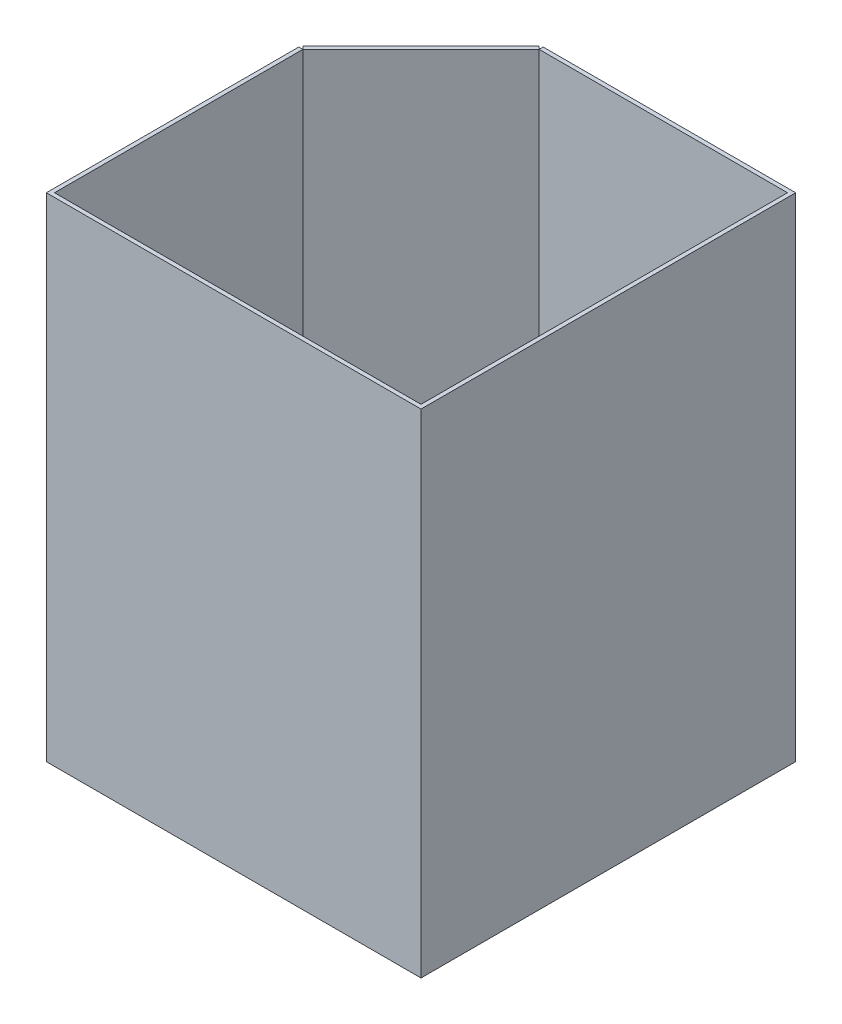
ISO-10303-21;
HEADER;
FILE_DESCRIPTION(('STEP AP214'),'2;1');
FILE_NAME('part.step','',(''),(''),'','','');
FILE_SCHEMA(('AUTOMOTIVE_DESIGN { 1 0 10303 214 1 1 1 1 }'));
ENDSEC;
DATA;
#1=APPLICATION_CONTEXT('core data for automotive mechanical design processes');
#2=APPLICATION_PROTOCOL_DEFINITION('international standard','automotive_design',2000,#1);
#3=PRODUCT_CONTEXT('',#1,'mechanical');
#4=PRODUCT('Part','Part','',(#3));
#5=PRODUCT_RELATED_PRODUCT_CATEGORY('part','',(#4));
#6=PRODUCT_DEFINITION_FORMATION('','',#4);
#7=PRODUCT_DEFINITION_CONTEXT('part definition',#1,'design');
#8=PRODUCT_DEFINITION('design','',#6,#7);
#9=PRODUCT_DEFINITION_SHAPE('','',#8);
#10=(LENGTH_UNIT() NAMED_UNIT(*) SI_UNIT(.MILLI.,.METRE.));
#11=(NAMED_UNIT(*) PLANE_ANGLE_UNIT() SI_UNIT($,.RADIAN.));
#12=(NAMED_UNIT(*) SI_UNIT($,.STERADIAN.) SOLID_ANGLE_UNIT());
#13=UNCERTAINTY_MEASURE_WITH_UNIT(LENGTH_MEASURE(1.E-05),#10,'distance_accuracy_value','');
#14=(GEOMETRIC_REPRESENTATION_CONTEXT(3) GLOBAL_UNCERTAINTY_ASSIGNED_CONTEXT((#13)) GLOBAL_UNIT_ASSIGNED_CONTEXT((#10,
#11,#12)) REPRESENTATION_CONTEXT('',''));
#15=CARTESIAN_POINT('',(0.,0.,0.));
#16=DIRECTION('',(0.,0.,1.));
#17=DIRECTION('',(1.,0.,0.));
#18=AXIS2_PLACEMENT_3D('',#15,#16,#17);
#19=CARTESIAN_POINT('',(0.,300.,0.));
#20=DIRECTION('',(0.,-1.,0.));
#21=DIRECTION('',(0.,0.,-1.));
#22=AXIS2_PLACEMENT_3D('',#19,#20,#21);
#23=PLANE('',#22);
#24=DIRECTION('',(0.,0.,-1.));
#25=VECTOR('',#24,1.);
#26=CARTESIAN_POINT('',(115.000000000003,300.,115.));
#27=LINE('',#26,#25);
#28=CARTESIAN_POINT('',(115.000000000003,300.,115.));
#29=VERTEX_POINT('',#28);
#30=CARTESIAN_POINT('',(115.000000000003,300.,-115.000000000003));
#31=VERTEX_POINT('',#30);
#32=EDGE_CURVE('E265',#29,#31,#27,.T.);
#33=ORIENTED_EDGE('',*,*,#32,.T.);
#34=DIRECTION('',(-1.,0.,0.));
#35=VECTOR('',#34,1.);
#36=CARTESIAN_POINT('',(-40.0000000000032,300.,-115.000000000003));
#37=LINE('',#36,#35);
#38=CARTESIAN_POINT('',(-40.0000000000032,300.,-115.000000000003));
#39=VERTEX_POINT('',#38);
#40=EDGE_CURVE('E165',#31,#39,#37,.T.);
#41=ORIENTED_EDGE('',*,*,#40,.T.);
#42=DIRECTION('',(0.,0.,1.));
#43=VECTOR('',#42,1.);
#44=CARTESIAN_POINT('',(-40.0000000000032,300.,-115.000000000003));
#45=LINE('',#44,#43);
#46=CARTESIAN_POINT('',(-40.0000000000033,300.,-113.078362506016));
#47=VERTEX_POINT('',#46);
#48=EDGE_CURVE('E270',#39,#47,#45,.T.);
#49=ORIENTED_EDGE('',*,*,#48,.T.);
#50=DIRECTION('',(-0.827419888908735,0.,0.561583767071535));
#51=VECTOR('',#50,1.);
#52=CARTESIAN_POINT('',(-40.3445265521216,300.,-112.844526552121));
#53=LINE('',#52,#51);
#54=CARTESIAN_POINT('',(-40.3445265521216,300.,-112.844526552121));
#55=VERTEX_POINT('',#54);
#56=EDGE_CURVE('E273',#47,#55,#53,.T.);
#57=ORIENTED_EDGE('',*,*,#56,.T.);
#58=DIRECTION('',(-0.707106781186432,0.,-0.707106781186663));
#59=VECTOR('',#58,1.);
#60=CARTESIAN_POINT('',(-40.3445265521216,300.,-112.844526552121));
#61=LINE('',#60,#59);
#62=CARTESIAN_POINT('',(-41.7677669529696,300.,-114.267766952969));
#63=VERTEX_POINT('',#62);
#64=EDGE_CURVE('E276',#55,#63,#61,.T.);
#65=ORIENTED_EDGE('',*,*,#64,.T.);
#66=DIRECTION('',(-0.707106781186665,0.,0.70710678118643));
#67=VECTOR('',#66,1.);
#68=CARTESIAN_POINT('',(-41.7677669529696,300.,-114.267766952969));
#69=LINE('',#68,#67);
#70=CARTESIAN_POINT('',(-114.267766952981,300.,-41.7677669529817));
#71=VERTEX_POINT('',#70);
#72=EDGE_CURVE('E279',#63,#71,#69,.T.);
#73=ORIENTED_EDGE('',*,*,#72,.T.);
#74=DIRECTION('',(0.707106781186431,0.,0.707106781186664));
#75=VECTOR('',#74,1.);
#76=CARTESIAN_POINT('',(-112.770991516759,300.,-40.2709915167589));
#77=LINE('',#76,#75);
#78=CARTESIAN_POINT('',(-112.770991516759,300.,-40.2709915167589));
#79=VERTEX_POINT('',#78);
#80=EDGE_CURVE('E282',#71,#79,#77,.T.);
#81=ORIENTED_EDGE('',*,*,#80,.T.);
#82=DIRECTION('',(-0.366036399959467,0.,0.930600534012695));
#83=VECTOR('',#82,1.);
#84=CARTESIAN_POINT('',(-112.770991516759,300.,-40.2709915167589));
#85=LINE('',#84,#83);
#86=CARTESIAN_POINT('',(-112.877581568654,300.,-40.));
#87=VERTEX_POINT('',#86);
#88=EDGE_CURVE('E285',#79,#87,#85,.T.);
#89=ORIENTED_EDGE('',*,*,#88,.T.);
#90=DIRECTION('',(-1.,0.,0.));
#91=VECTOR('',#90,1.);
#92=CARTESIAN_POINT('',(-115.,300.,-40.));
#93=LINE('',#92,#91);
#94=CARTESIAN_POINT('',(-115.,300.,-40.));
#95=VERTEX_POINT('',#94);
#96=EDGE_CURVE('E288',#87,#95,#93,.T.);
#97=ORIENTED_EDGE('',*,*,#96,.T.);
#98=DIRECTION('',(0.,0.,1.));
#99=VECTOR('',#98,1.);
#100=CARTESIAN_POINT('',(-115.,300.,115.));
#101=LINE('',#100,#99);
#102=CARTESIAN_POINT('',(-115.,300.,115.));
#103=VERTEX_POINT('',#102);
#104=EDGE_CURVE('E291',#95,#103,#101,.T.);
#105=ORIENTED_EDGE('',*,*,#104,.T.);
#106=DIRECTION('',(1.,0.,0.));
#107=VECTOR('',#106,1.);
#108=CARTESIAN_POINT('',(-115.,300.,115.));
#109=LINE('',#108,#107);
#110=EDGE_CURVE('E294',#103,#29,#109,.T.);
#111=ORIENTED_EDGE('',*,*,#110,.T.);
#112=EDGE_LOOP('',(#33,#41,#49,#57,#65,#73,#81,#89,#97,#105,#111));
#113=FACE_BOUND('',#112,.T.);
#114=DIRECTION('',(-0.707106781186518,0.,0.707106781186577));
#115=VECTOR('',#114,1.);
#116=CARTESIAN_POINT('',(-40.0000000000032,300.,-112.500000000003));
#117=LINE('',#116,#115);
#118=CARTESIAN_POINT('',(-40.0000000000032,300.,-112.500000000003));
#119=VERTEX_POINT('',#118);
#120=CARTESIAN_POINT('',(-112.5,300.,-40.));
#121=VERTEX_POINT('',#120);
#122=EDGE_CURVE('E218',#119,#121,#117,.T.);
#123=ORIENTED_EDGE('',*,*,#122,.F.);
#124=DIRECTION('',(-1.,0.,0.));
#125=VECTOR('',#124,1.);
#126=CARTESIAN_POINT('',(-40.0000000000032,300.,-112.500000000003));
#127=LINE('',#126,#125);
#128=CARTESIAN_POINT('',(112.500000000003,300.,-112.500000000003));
#129=VERTEX_POINT('',#128);
#130=EDGE_CURVE('E231',#129,#119,#127,.T.);
#131=ORIENTED_EDGE('',*,*,#130,.F.);
#132=DIRECTION('',(0.,0.,-1.));
#133=VECTOR('',#132,1.);
#134=CARTESIAN_POINT('',(112.500000000003,300.,112.5));
#135=LINE('',#134,#133);
#136=CARTESIAN_POINT('',(112.500000000003,300.,112.5));
#137=VERTEX_POINT('',#136);
#138=EDGE_CURVE('E228',#137,#129,#135,.T.);
#139=ORIENTED_EDGE('',*,*,#138,.F.);
#140=DIRECTION('',(1.,0.,0.));
#141=VECTOR('',#140,1.);
#142=CARTESIAN_POINT('',(-112.5,300.,112.5));
#143=LINE('',#142,#141);
#144=CARTESIAN_POINT('',(-112.5,300.,112.5));
#145=VERTEX_POINT('',#144);
#146=EDGE_CURVE('E225',#145,#137,#143,.T.);
#147=ORIENTED_EDGE('',*,*,#146,.F.);
#148=DIRECTION('',(0.,0.,1.));
#149=VECTOR('',#148,1.);
#150=CARTESIAN_POINT('',(-112.5,300.,112.5));
#151=LINE('',#150,#149);
#152=EDGE_CURVE('E221',#121,#145,#151,.T.);
#153=ORIENTED_EDGE('',*,*,#152,.F.);
#154=EDGE_LOOP('',(#123,#131,#139,#147,#153));
#155=FACE_BOUND('',#154,.T.);
#156=ADVANCED_FACE('F45',(#113,#155),#23,.F.);
#157=CARTESIAN_POINT('',(115.000000000003,300.,115.));
#158=DIRECTION('',(-1.,0.,0.));
#159=DIRECTION('',(0.,0.,1.));
#160=AXIS2_PLACEMENT_3D('',#157,#158,#159);
#161=PLANE('',#160);
#162=DIRECTION('',(0.,-1.,0.));
#163=VECTOR('',#162,1.);
#164=CARTESIAN_POINT('',(115.000000000003,300.,115.));
#165=LINE('',#164,#163);
#166=CARTESIAN_POINT('',(115.000000000003,-2.5,115.));
#167=VERTEX_POINT('',#166);
#168=EDGE_CURVE('E172',#29,#167,#165,.T.);
#169=ORIENTED_EDGE('',*,*,#168,.T.);
#170=DIRECTION('',(0.,0.,1.));
#171=VECTOR('',#170,1.);
#172=CARTESIAN_POINT('',(115.000000000003,-2.5,-115.000000000003));
#173=LINE('',#172,#171);
#174=CARTESIAN_POINT('',(115.000000000003,-2.5,-115.000000000003));
#175=VERTEX_POINT('',#174);
#176=EDGE_CURVE('E170',#175,#167,#173,.T.);
#177=ORIENTED_EDGE('',*,*,#176,.F.);
#178=DIRECTION('',(0.,-1.,0.));
#179=VECTOR('',#178,1.);
#180=CARTESIAN_POINT('',(115.000000000003,300.,-115.000000000003));
#181=LINE('',#180,#179);
#182=EDGE_CURVE('E11',#31,#175,#181,.T.);
#183=ORIENTED_EDGE('',*,*,#182,.F.);
#184=ORIENTED_EDGE('',*,*,#32,.F.);
#185=EDGE_LOOP('',(#169,#177,#183,#184));
#186=FACE_BOUND('',#185,.T.);
#187=ADVANCED_FACE('F47',(#186),#161,.F.);
#188=CARTESIAN_POINT('',(-40.0000000000032,300.,-115.000000000003));
#189=DIRECTION('',(0.,0.,1.));
#190=DIRECTION('',(1.,0.,0.));
#191=AXIS2_PLACEMENT_3D('',#188,#189,#190);
#192=PLANE('',#191);
#193=ORIENTED_EDGE('',*,*,#182,.T.);
#194=DIRECTION('',(1.,0.,0.));
#195=VECTOR('',#194,1.);
#196=CARTESIAN_POINT('',(-40.0000000000032,-2.5,-115.000000000003));
#197=LINE('',#196,#195);
#198=CARTESIAN_POINT('',(-40.0000000000032,-2.5,-115.000000000003));
#199=VERTEX_POINT('',#198);
#200=EDGE_CURVE('E164',#199,#175,#197,.T.);
#201=ORIENTED_EDGE('',*,*,#200,.F.);
#202=DIRECTION('',(0.,-1.,0.));
#203=VECTOR('',#202,1.);
#204=CARTESIAN_POINT('',(-40.0000000000032,300.,-115.000000000003));
#205=LINE('',#204,#203);
#206=EDGE_CURVE('E54',#39,#199,#205,.T.);
#207=ORIENTED_EDGE('',*,*,#206,.F.);
#208=ORIENTED_EDGE('',*,*,#40,.F.);
#209=EDGE_LOOP('',(#193,#201,#207,#208));
#210=FACE_BOUND('',#209,.T.);
#211=ADVANCED_FACE('F161',(#210),#192,.F.);
#212=CARTESIAN_POINT('',(-40.0000000000032,300.,-115.000000000003));
#213=DIRECTION('',(1.,0.,0.));
#214=DIRECTION('',(0.,0.,-1.));
#215=AXIS2_PLACEMENT_3D('',#212,#213,#214);
#216=PLANE('',#215);
#217=ORIENTED_EDGE('',*,*,#206,.T.);
#218=DIRECTION('',(0.,0.,-1.));
#219=VECTOR('',#218,1.);
#220=CARTESIAN_POINT('',(-40.0000000000033,-2.5,-113.078362506016));
#221=LINE('',#220,#219);
#222=CARTESIAN_POINT('',(-40.0000000000033,-2.5,-113.078362506016));
#223=VERTEX_POINT('',#222);
#224=EDGE_CURVE('E183',#223,#199,#221,.T.);
#225=ORIENTED_EDGE('',*,*,#224,.F.);
#226=DIRECTION('',(0.,-1.,0.));
#227=VECTOR('',#226,1.);
#228=CARTESIAN_POINT('',(-40.0000000000033,300.,-113.078362506016));
#229=LINE('',#228,#227);
#230=EDGE_CURVE('E320',#47,#223,#229,.T.);
#231=ORIENTED_EDGE('',*,*,#230,.F.);
#232=ORIENTED_EDGE('',*,*,#48,.F.);
#233=EDGE_LOOP('',(#217,#225,#231,#232));
#234=FACE_BOUND('',#233,.T.);
#235=ADVANCED_FACE('F325',(#234),#216,.F.);
#236=CARTESIAN_POINT('',(-40.3445265521216,300.,-112.844526552121));
#237=DIRECTION('',(0.561583767071535,0.,0.827419888908736));
#238=DIRECTION('',(0.827419888908736,0.,-0.561583767071535));
#239=AXIS2_PLACEMENT_3D('',#236,#237,#238);
#240=PLANE('',#239);
#241=ORIENTED_EDGE('',*,*,#230,.T.);
#242=DIRECTION('',(0.827419888908735,0.,-0.561583767071535));
#243=VECTOR('',#242,1.);
#244=CARTESIAN_POINT('',(-40.3445265521216,-2.5,-112.844526552121));
#245=LINE('',#244,#243);
#246=CARTESIAN_POINT('',(-40.3445265521216,-2.5,-112.844526552121));
#247=VERTEX_POINT('',#246);
#248=EDGE_CURVE('E213',#247,#223,#245,.T.);
#249=ORIENTED_EDGE('',*,*,#248,.F.);
#250=DIRECTION('',(0.,-1.,0.));
#251=VECTOR('',#250,1.);
#252=CARTESIAN_POINT('',(-40.3445265521216,300.,-112.844526552121));
#253=LINE('',#252,#251);
#254=EDGE_CURVE('E317',#55,#247,#253,.T.);
#255=ORIENTED_EDGE('',*,*,#254,.F.);
#256=ORIENTED_EDGE('',*,*,#56,.F.);
#257=EDGE_LOOP('',(#241,#249,#255,#256));
#258=FACE_BOUND('',#257,.T.);
#259=ADVANCED_FACE('F366',(#258),#240,.F.);
#260=CARTESIAN_POINT('',(-40.3445265521216,300.,-112.844526552121));
#261=DIRECTION('',(-0.707106781186663,0.,0.707106781186432));
#262=DIRECTION('',(0.707106781186432,0.,0.707106781186663));
#263=AXIS2_PLACEMENT_3D('',#260,#261,#262);
#264=PLANE('',#263);
#265=ORIENTED_EDGE('',*,*,#254,.T.);
#266=DIRECTION('',(0.707106781186432,0.,0.707106781186663));
#267=VECTOR('',#266,1.);
#268=CARTESIAN_POINT('',(-41.7677669529696,-2.5,-114.267766952969));
#269=LINE('',#268,#267);
#270=CARTESIAN_POINT('',(-41.7677669529696,-2.5,-114.267766952969));
#271=VERTEX_POINT('',#270);
#272=EDGE_CURVE('E209',#271,#247,#269,.T.);
#273=ORIENTED_EDGE('',*,*,#272,.F.);
#274=DIRECTION('',(0.,-1.,0.));
#275=VECTOR('',#274,1.);
#276=CARTESIAN_POINT('',(-41.7677669529696,300.,-114.267766952969));
#277=LINE('',#276,#275);
#278=EDGE_CURVE('E314',#63,#271,#277,.T.);
#279=ORIENTED_EDGE('',*,*,#278,.F.);
#280=ORIENTED_EDGE('',*,*,#64,.F.);
#281=EDGE_LOOP('',(#265,#273,#279,#280));
#282=FACE_BOUND('',#281,.T.);
#283=ADVANCED_FACE('F363',(#282),#264,.F.);
#284=CARTESIAN_POINT('',(-41.7677669529696,300.,-114.267766952969));
#285=DIRECTION('',(0.70710678118643,0.,0.707106781186665));
#286=DIRECTION('',(0.707106781186665,0.,-0.70710678118643));
#287=AXIS2_PLACEMENT_3D('',#284,#285,#286);
#288=PLANE('',#287);
#289=ORIENTED_EDGE('',*,*,#278,.T.);
#290=DIRECTION('',(0.707106781186665,0.,-0.70710678118643));
#291=VECTOR('',#290,1.);
#292=CARTESIAN_POINT('',(-114.267766952981,-2.5,-41.7677669529817));
#293=LINE('',#292,#291);
#294=CARTESIAN_POINT('',(-114.267766952981,-2.5,-41.7677669529817));
#295=VERTEX_POINT('',#294);
#296=EDGE_CURVE('E205',#295,#271,#293,.T.);
#297=ORIENTED_EDGE('',*,*,#296,.F.);
#298=DIRECTION('',(0.,-1.,0.));
#299=VECTOR('',#298,1.);
#300=CARTESIAN_POINT('',(-114.267766952981,300.,-41.7677669529817));
#301=LINE('',#300,#299);
#302=EDGE_CURVE('E311',#71,#295,#301,.T.);
#303=ORIENTED_EDGE('',*,*,#302,.F.);
#304=ORIENTED_EDGE('',*,*,#72,.F.);
#305=EDGE_LOOP('',(#289,#297,#303,#304));
#306=FACE_BOUND('',#305,.T.);
#307=ADVANCED_FACE('F358',(#306),#288,.F.);
#308=CARTESIAN_POINT('',(-112.770991516759,300.,-40.2709915167589));
#309=DIRECTION('',(0.707106781186664,0.,-0.707106781186431));
#310=DIRECTION('',(-0.707106781186431,0.,-0.707106781186664));
#311=AXIS2_PLACEMENT_3D('',#308,#309,#310);
#312=PLANE('',#311);
#313=ORIENTED_EDGE('',*,*,#302,.T.);
#314=DIRECTION('',(-0.707106781186431,0.,-0.707106781186664));
#315=VECTOR('',#314,1.);
#316=CARTESIAN_POINT('',(-112.770991516759,-2.5,-40.2709915167589));
#317=LINE('',#316,#315);
#318=CARTESIAN_POINT('',(-112.770991516759,-2.5,-40.2709915167589));
#319=VERTEX_POINT('',#318);
#320=EDGE_CURVE('E201',#319,#295,#317,.T.);
#321=ORIENTED_EDGE('',*,*,#320,.F.);
#322=DIRECTION('',(0.,-1.,0.));
#323=VECTOR('',#322,1.);
#324=CARTESIAN_POINT('',(-112.770991516759,300.,-40.2709915167589));
#325=LINE('',#324,#323);
#326=EDGE_CURVE('E308',#79,#319,#325,.T.);
#327=ORIENTED_EDGE('',*,*,#326,.F.);
#328=ORIENTED_EDGE('',*,*,#80,.F.);
#329=EDGE_LOOP('',(#313,#321,#327,#328));
#330=FACE_BOUND('',#329,.T.);
#331=ADVANCED_FACE('F353',(#330),#312,.F.);
#332=CARTESIAN_POINT('',(-112.770991516759,300.,-40.2709915167589));
#333=DIRECTION('',(0.930600534012695,0.,0.366036399959467));
#334=DIRECTION('',(0.366036399959467,0.,-0.930600534012695));
#335=AXIS2_PLACEMENT_3D('',#332,#333,#334);
#336=PLANE('',#335);
#337=ORIENTED_EDGE('',*,*,#326,.T.);
#338=DIRECTION('',(0.366036399959467,0.,-0.930600534012695));
#339=VECTOR('',#338,1.);
#340=CARTESIAN_POINT('',(-112.877581568654,-2.5,-40.));
#341=LINE('',#340,#339);
#342=CARTESIAN_POINT('',(-112.877581568654,-2.5,-40.));
#343=VERTEX_POINT('',#342);
#344=EDGE_CURVE('E197',#343,#319,#341,.T.);
#345=ORIENTED_EDGE('',*,*,#344,.F.);
#346=DIRECTION('',(0.,-1.,0.));
#347=VECTOR('',#346,1.);
#348=CARTESIAN_POINT('',(-112.877581568654,300.,-40.));
#349=LINE('',#348,#347);
#350=EDGE_CURVE('E305',#87,#343,#349,.T.);
#351=ORIENTED_EDGE('',*,*,#350,.F.);
#352=ORIENTED_EDGE('',*,*,#88,.F.);
#353=EDGE_LOOP('',(#337,#345,#351,#352));
#354=FACE_BOUND('',#353,.T.);
#355=ADVANCED_FACE('F348',(#354),#336,.F.);
#356=CARTESIAN_POINT('',(-115.,300.,-40.));
#357=DIRECTION('',(0.,0.,1.));
#358=DIRECTION('',(1.,0.,0.));
#359=AXIS2_PLACEMENT_3D('',#356,#357,#358);
#360=PLANE('',#359);
#361=ORIENTED_EDGE('',*,*,#350,.T.);
#362=DIRECTION('',(1.,0.,0.));
#363=VECTOR('',#362,1.);
#364=CARTESIAN_POINT('',(-115.,-2.5,-40.));
#365=LINE('',#364,#363);
#366=CARTESIAN_POINT('',(-115.,-2.5,-40.));
#367=VERTEX_POINT('',#366);
#368=EDGE_CURVE('E193',#367,#343,#365,.T.);
#369=ORIENTED_EDGE('',*,*,#368,.F.);
#370=DIRECTION('',(0.,-1.,0.));
#371=VECTOR('',#370,1.);
#372=CARTESIAN_POINT('',(-115.,300.,-40.));
#373=LINE('',#372,#371);
#374=EDGE_CURVE('E302',#95,#367,#373,.T.);
#375=ORIENTED_EDGE('',*,*,#374,.F.);
#376=ORIENTED_EDGE('',*,*,#96,.F.);
#377=EDGE_LOOP('',(#361,#369,#375,#376));
#378=FACE_BOUND('',#377,.T.);
#379=ADVANCED_FACE('F343',(#378),#360,.F.);
#380=CARTESIAN_POINT('',(-115.,300.,115.));
#381=DIRECTION('',(1.,0.,0.));
#382=DIRECTION('',(0.,0.,-1.));
#383=AXIS2_PLACEMENT_3D('',#380,#381,#382);
#384=PLANE('',#383);
#385=ORIENTED_EDGE('',*,*,#374,.T.);
#386=DIRECTION('',(0.,0.,-1.));
#387=VECTOR('',#386,1.);
#388=CARTESIAN_POINT('',(-115.,-2.5,115.));
#389=LINE('',#388,#387);
#390=CARTESIAN_POINT('',(-115.,-2.5,115.));
#391=VERTEX_POINT('',#390);
#392=EDGE_CURVE('E189',#391,#367,#389,.T.);
#393=ORIENTED_EDGE('',*,*,#392,.F.);
#394=DIRECTION('',(0.,-1.,0.));
#395=VECTOR('',#394,1.);
#396=CARTESIAN_POINT('',(-115.,300.,115.));
#397=LINE('',#396,#395);
#398=EDGE_CURVE('E299',#103,#391,#397,.T.);
#399=ORIENTED_EDGE('',*,*,#398,.F.);
#400=ORIENTED_EDGE('',*,*,#104,.F.);
#401=EDGE_LOOP('',(#385,#393,#399,#400));
#402=FACE_BOUND('',#401,.T.);
#403=ADVANCED_FACE('F339',(#402),#384,.F.);
#404=CARTESIAN_POINT('',(-115.,300.,115.));
#405=DIRECTION('',(0.,0.,-1.));
#406=DIRECTION('',(-1.,0.,0.));
#407=AXIS2_PLACEMENT_3D('',#404,#405,#406);
#408=PLANE('',#407);
#409=ORIENTED_EDGE('',*,*,#398,.T.);
#410=DIRECTION('',(-1.,0.,0.));
#411=VECTOR('',#410,1.);
#412=CARTESIAN_POINT('',(115.000000000003,-2.5,115.));
#413=LINE('',#412,#411);
#414=EDGE_CURVE('E177',#167,#391,#413,.T.);
#415=ORIENTED_EDGE('',*,*,#414,.F.);
#416=ORIENTED_EDGE('',*,*,#168,.F.);
#417=ORIENTED_EDGE('',*,*,#110,.F.);
#418=EDGE_LOOP('',(#409,#415,#416,#417));
#419=FACE_BOUND('',#418,.T.);
#420=ADVANCED_FACE('F335',(#419),#408,.F.);
#421=CARTESIAN_POINT('',(-40.0000000000032,300.,-112.500000000003));
#422=DIRECTION('',(0.707106781186577,0.,0.707106781186518));
#423=DIRECTION('',(0.707106781186518,0.,-0.707106781186577));
#424=AXIS2_PLACEMENT_3D('',#421,#422,#423);
#425=PLANE('',#424);
#426=DIRECTION('',(-0.707106781186518,0.,0.707106781186577));
#427=VECTOR('',#426,1.);
#428=CARTESIAN_POINT('',(-40.0000000000032,0.,-112.500000000003));
#429=LINE('',#428,#427);
#430=CARTESIAN_POINT('',(-40.0000000000032,0.,-112.500000000003));
#431=VERTEX_POINT('',#430);
#432=CARTESIAN_POINT('',(-112.5,0.,-40.));
#433=VERTEX_POINT('',#432);
#434=EDGE_CURVE('E69',#431,#433,#429,.T.);
#435=ORIENTED_EDGE('',*,*,#434,.F.);
#436=DIRECTION('',(0.,-1.,0.));
#437=VECTOR('',#436,1.);
#438=CARTESIAN_POINT('',(-40.0000000000032,300.,-112.500000000003));
#439=LINE('',#438,#437);
#440=EDGE_CURVE('E234',#119,#431,#439,.T.);
#441=ORIENTED_EDGE('',*,*,#440,.F.);
#442=ORIENTED_EDGE('',*,*,#122,.T.);
#443=DIRECTION('',(0.,-1.,0.));
#444=VECTOR('',#443,1.);
#445=CARTESIAN_POINT('',(-112.5,300.,-40.));
#446=LINE('',#445,#444);
#447=EDGE_CURVE('E262',#121,#433,#446,.T.);
#448=ORIENTED_EDGE('',*,*,#447,.T.);
#449=EDGE_LOOP('',(#435,#441,#442,#448));
#450=FACE_BOUND('',#449,.T.);
#451=ADVANCED_FACE('F382',(#450),#425,.T.);
#452=CARTESIAN_POINT('',(-112.5,300.,112.5));
#453=DIRECTION('',(1.,0.,0.));
#454=DIRECTION('',(0.,0.,-1.));
#455=AXIS2_PLACEMENT_3D('',#452,#453,#454);
#456=PLANE('',#455);
#457=DIRECTION('',(0.,0.,1.));
#458=VECTOR('',#457,1.);
#459=CARTESIAN_POINT('',(-112.5,0.,112.5));
#460=LINE('',#459,#458);
#461=CARTESIAN_POINT('',(-112.5,0.,112.5));
#462=VERTEX_POINT('',#461);
#463=EDGE_CURVE('E237',#433,#462,#460,.T.);
#464=ORIENTED_EDGE('',*,*,#463,.F.);
#465=ORIENTED_EDGE('',*,*,#447,.F.);
#466=ORIENTED_EDGE('',*,*,#152,.T.);
#467=DIRECTION('',(0.,-1.,0.));
#468=VECTOR('',#467,1.);
#469=CARTESIAN_POINT('',(-112.5,300.,112.5));
#470=LINE('',#469,#468);
#471=EDGE_CURVE('E259',#145,#462,#470,.T.);
#472=ORIENTED_EDGE('',*,*,#471,.T.);
#473=EDGE_LOOP('',(#464,#465,#466,#472));
#474=FACE_BOUND('',#473,.T.);
#475=ADVANCED_FACE('F432',(#474),#456,.T.);
#476=CARTESIAN_POINT('',(-112.5,300.,112.5));
#477=DIRECTION('',(0.,0.,-1.));
#478=DIRECTION('',(-1.,0.,0.));
#479=AXIS2_PLACEMENT_3D('',#476,#477,#478);
#480=PLANE('',#479);
#481=DIRECTION('',(1.,0.,0.));
#482=VECTOR('',#481,1.);
#483=CARTESIAN_POINT('',(-112.5,0.,112.5));
#484=LINE('',#483,#482);
#485=CARTESIAN_POINT('',(112.500000000003,0.,112.5));
#486=VERTEX_POINT('',#485);
#487=EDGE_CURVE('E241',#462,#486,#484,.T.);
#488=ORIENTED_EDGE('',*,*,#487,.F.);
#489=ORIENTED_EDGE('',*,*,#471,.F.);
#490=ORIENTED_EDGE('',*,*,#146,.T.);
#491=DIRECTION('',(0.,-1.,0.));
#492=VECTOR('',#491,1.);
#493=CARTESIAN_POINT('',(112.500000000003,300.,112.5));
#494=LINE('',#493,#492);
#495=EDGE_CURVE('E256',#137,#486,#494,.T.);
#496=ORIENTED_EDGE('',*,*,#495,.T.);
#497=EDGE_LOOP('',(#488,#489,#490,#496));
#498=FACE_BOUND('',#497,.T.);
#499=ADVANCED_FACE('F439',(#498),#480,.T.);
#500=CARTESIAN_POINT('',(112.500000000003,300.,112.5));
#501=DIRECTION('',(-1.,0.,0.));
#502=DIRECTION('',(0.,0.,1.));
#503=AXIS2_PLACEMENT_3D('',#500,#501,#502);
#504=PLANE('',#503);
#505=DIRECTION('',(0.,0.,-1.));
#506=VECTOR('',#505,1.);
#507=CARTESIAN_POINT('',(112.500000000003,0.,112.5));
#508=LINE('',#507,#506);
#509=CARTESIAN_POINT('',(112.500000000003,0.,-112.500000000003));
#510=VERTEX_POINT('',#509);
#511=EDGE_CURVE('E245',#486,#510,#508,.T.);
#512=ORIENTED_EDGE('',*,*,#511,.F.);
#513=ORIENTED_EDGE('',*,*,#495,.F.);
#514=ORIENTED_EDGE('',*,*,#138,.T.);
#515=DIRECTION('',(0.,-1.,0.));
#516=VECTOR('',#515,1.);
#517=CARTESIAN_POINT('',(112.500000000003,300.,-112.500000000003));
#518=LINE('',#517,#516);
#519=EDGE_CURVE('E61',#129,#510,#518,.T.);
#520=ORIENTED_EDGE('',*,*,#519,.T.);
#521=EDGE_LOOP('',(#512,#513,#514,#520));
#522=FACE_BOUND('',#521,.T.);
#523=ADVANCED_FACE('F447',(#522),#504,.T.);
#524=CARTESIAN_POINT('',(-40.0000000000032,300.,-112.500000000003));
#525=DIRECTION('',(0.,0.,1.));
#526=DIRECTION('',(1.,0.,0.));
#527=AXIS2_PLACEMENT_3D('',#524,#525,#526);
#528=PLANE('',#527);
#529=DIRECTION('',(-1.,0.,0.));
#530=VECTOR('',#529,1.);
#531=CARTESIAN_POINT('',(-40.0000000000032,0.,-112.500000000003));
#532=LINE('',#531,#530);
#533=EDGE_CURVE('E222',#510,#431,#532,.T.);
#534=ORIENTED_EDGE('',*,*,#533,.F.);
#535=ORIENTED_EDGE('',*,*,#519,.F.);
#536=ORIENTED_EDGE('',*,*,#130,.T.);
#537=ORIENTED_EDGE('',*,*,#440,.T.);
#538=EDGE_LOOP('',(#534,#535,#536,#537));
#539=FACE_BOUND('',#538,.T.);
#540=ADVANCED_FACE('F456',(#539),#528,.T.);
#541=CARTESIAN_POINT('',(0.,0.,0.));
#542=DIRECTION('',(0.,-1.,0.));
#543=DIRECTION('',(0.,0.,-1.));
#544=AXIS2_PLACEMENT_3D('',#541,#542,#543);
#545=PLANE('',#544);
#546=ORIENTED_EDGE('',*,*,#511,.T.);
#547=ORIENTED_EDGE('',*,*,#533,.T.);
#548=ORIENTED_EDGE('',*,*,#434,.T.);
#549=ORIENTED_EDGE('',*,*,#463,.T.);
#550=ORIENTED_EDGE('',*,*,#487,.T.);
#551=EDGE_LOOP('',(#546,#547,#548,#549,#550));
#552=FACE_BOUND('',#551,.T.);
#553=ADVANCED_FACE('F465',(#552),#545,.F.);
#554=CARTESIAN_POINT('',(0.,-2.5,0.));
#555=DIRECTION('',(0.,-1.,0.));
#556=DIRECTION('',(0.,0.,-1.));
#557=AXIS2_PLACEMENT_3D('',#554,#555,#556);
#558=PLANE('',#557);
#559=ORIENTED_EDGE('',*,*,#200,.T.);
#560=ORIENTED_EDGE('',*,*,#176,.T.);
#561=ORIENTED_EDGE('',*,*,#414,.T.);
#562=ORIENTED_EDGE('',*,*,#392,.T.);
#563=ORIENTED_EDGE('',*,*,#368,.T.);
#564=ORIENTED_EDGE('',*,*,#344,.T.);
#565=ORIENTED_EDGE('',*,*,#320,.T.);
#566=ORIENTED_EDGE('',*,*,#296,.T.);
#567=ORIENTED_EDGE('',*,*,#272,.T.);
#568=ORIENTED_EDGE('',*,*,#248,.T.);
#569=ORIENTED_EDGE('',*,*,#224,.T.);
#570=EDGE_LOOP('',(#559,#560,#561,#562,#563,#564,#565,#566,#567,#568,#569));
#571=FACE_BOUND('',#570,.T.);
#572=ADVANCED_FACE('F180',(#571),#558,.T.);
#573=CLOSED_SHELL('',(#156,#187,#211,#235,#259,#283,#307,#331,#355,#379,#403,#420,#451,#475,
#499,#523,#540,#553,#572));
#574=MANIFOLD_SOLID_BREP('B2',#573);
#575=ADVANCED_BREP_SHAPE_REPRESENTATION('',(#18,#574),#14);
#576=SHAPE_DEFINITION_REPRESENTATION(#9,#575);
ENDSEC;
END-ISO-10303-21;
